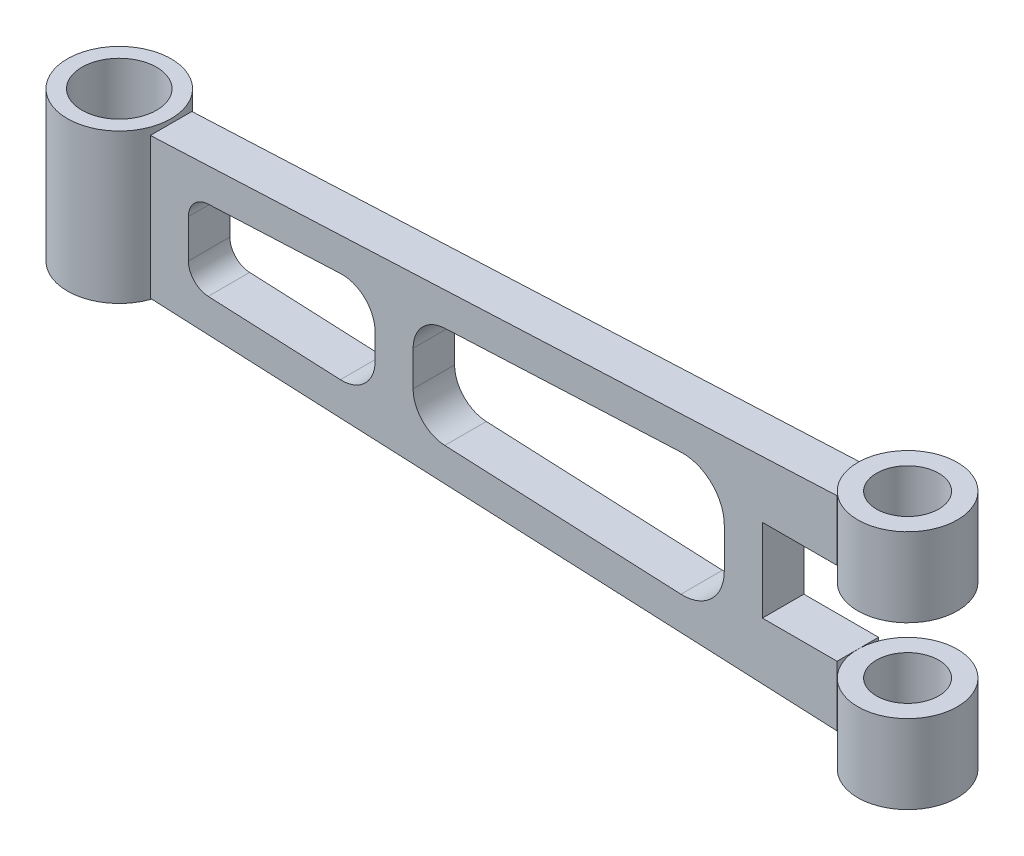
ISO-10303-21;
HEADER;
FILE_DESCRIPTION(('STEP AP214'),'2;1');
FILE_NAME('part.step','',(''),(''),'','','');
FILE_SCHEMA(('AUTOMOTIVE_DESIGN { 1 0 10303 214 1 1 1 1 }'));
ENDSEC;
DATA;
#1=APPLICATION_CONTEXT('core data for automotive mechanical design processes');
#2=APPLICATION_PROTOCOL_DEFINITION('international standard','automotive_design',2000,#1);
#3=PRODUCT_CONTEXT('',#1,'mechanical');
#4=PRODUCT('Part','Part','',(#3));
#5=PRODUCT_RELATED_PRODUCT_CATEGORY('part','',(#4));
#6=PRODUCT_DEFINITION_FORMATION('','',#4);
#7=PRODUCT_DEFINITION_CONTEXT('part definition',#1,'design');
#8=PRODUCT_DEFINITION('design','',#6,#7);
#9=PRODUCT_DEFINITION_SHAPE('','',#8);
#10=(LENGTH_UNIT() NAMED_UNIT(*) SI_UNIT(.MILLI.,.METRE.));
#11=(NAMED_UNIT(*) PLANE_ANGLE_UNIT() SI_UNIT($,.RADIAN.));
#12=(NAMED_UNIT(*) SI_UNIT($,.STERADIAN.) SOLID_ANGLE_UNIT());
#13=UNCERTAINTY_MEASURE_WITH_UNIT(LENGTH_MEASURE(1.E-05),#10,'distance_accuracy_value','');
#14=(GEOMETRIC_REPRESENTATION_CONTEXT(3) GLOBAL_UNCERTAINTY_ASSIGNED_CONTEXT((#13)) GLOBAL_UNIT_ASSIGNED_CONTEXT((#10,
#11,#12)) REPRESENTATION_CONTEXT('',''));
#15=CARTESIAN_POINT('',(0.,0.,0.));
#16=DIRECTION('',(0.,0.,1.));
#17=DIRECTION('',(1.,0.,0.));
#18=AXIS2_PLACEMENT_3D('',#15,#16,#17);
#19=CARTESIAN_POINT('',(177.5,29.,-5.));
#20=DIRECTION('',(0.,-1.,0.));
#21=DIRECTION('',(0.,0.,1.));
#22=AXIS2_PLACEMENT_3D('',#19,#20,#21);
#23=CYLINDRICAL_SURFACE('',#22,12.);
#24=CARTESIAN_POINT('',(177.5,29.,-5.));
#25=DIRECTION('',(0.,1.,0.));
#26=DIRECTION('',(0.,0.,1.));
#27=AXIS2_PLACEMENT_3D('',#24,#25,#26);
#28=CIRCLE('',#27,12.);
#29=CARTESIAN_POINT('',(177.5,29.,7.));
#30=VERTEX_POINT('',#29);
#31=EDGE_CURVE('E11',#30,#30,#28,.T.);
#32=ORIENTED_EDGE('',*,*,#31,.F.);
#33=EDGE_LOOP('',(#32));
#34=FACE_BOUND('',#33,.T.);
#35=CARTESIAN_POINT('',(177.5,10.,-5.));
#36=DIRECTION('',(0.,1.,0.));
#37=DIRECTION('',(0.,0.,1.));
#38=AXIS2_PLACEMENT_3D('',#35,#36,#37);
#39=CIRCLE('',#38,12.);
#40=CARTESIAN_POINT('',(177.5,10.,7.));
#41=VERTEX_POINT('',#40);
#42=EDGE_CURVE('E56',#41,#41,#39,.T.);
#43=ORIENTED_EDGE('',*,*,#42,.T.);
#44=EDGE_LOOP('',(#43));
#45=FACE_BOUND('',#44,.T.);
#46=ADVANCED_FACE('F53',(#34,#45),#23,.T.);
#47=CARTESIAN_POINT('',(177.5,29.,-5.));
#48=DIRECTION('',(0.,-1.,0.));
#49=DIRECTION('',(0.,0.,1.));
#50=AXIS2_PLACEMENT_3D('',#47,#48,#49);
#51=PLANE('',#50);
#52=CARTESIAN_POINT('',(177.5,29.,-5.));
#53=DIRECTION('',(0.,1.,0.));
#54=DIRECTION('',(0.,0.,1.));
#55=AXIS2_PLACEMENT_3D('',#52,#53,#54);
#56=CIRCLE('',#55,7.50000000000001);
#57=CARTESIAN_POINT('',(177.5,29.,2.50000000000001));
#58=VERTEX_POINT('',#57);
#59=EDGE_CURVE('E63',#58,#58,#56,.T.);
#60=ORIENTED_EDGE('',*,*,#59,.F.);
#61=EDGE_LOOP('',(#60));
#62=FACE_BOUND('',#61,.T.);
#63=ORIENTED_EDGE('',*,*,#31,.T.);
#64=EDGE_LOOP('',(#63));
#65=FACE_BOUND('',#64,.T.);
#66=ADVANCED_FACE('F74',(#62,#65),#51,.F.);
#67=CARTESIAN_POINT('',(177.5,10.,-5.));
#68=DIRECTION('',(0.,-1.,0.));
#69=DIRECTION('',(0.,0.,1.));
#70=AXIS2_PLACEMENT_3D('',#67,#68,#69);
#71=PLANE('',#70);
#72=CARTESIAN_POINT('',(177.5,10.,-5.));
#73=DIRECTION('',(0.,1.,0.));
#74=DIRECTION('',(0.,0.,1.));
#75=AXIS2_PLACEMENT_3D('',#72,#73,#74);
#76=CIRCLE('',#75,7.50000000000001);
#77=CARTESIAN_POINT('',(177.5,10.,2.50000000000001));
#78=VERTEX_POINT('',#77);
#79=EDGE_CURVE('E65',#78,#78,#76,.T.);
#80=ORIENTED_EDGE('',*,*,#79,.T.);
#81=EDGE_LOOP('',(#80));
#82=FACE_BOUND('',#81,.T.);
#83=ORIENTED_EDGE('',*,*,#42,.F.);
#84=EDGE_LOOP('',(#83));
#85=FACE_BOUND('',#84,.T.);
#86=ADVANCED_FACE('F76',(#82,#85),#71,.T.);
#87=CARTESIAN_POINT('',(177.5,29.,-5.));
#88=DIRECTION('',(0.,-1.,0.));
#89=DIRECTION('',(0.,0.,1.));
#90=AXIS2_PLACEMENT_3D('',#87,#88,#89);
#91=CYLINDRICAL_SURFACE('',#90,7.50000000000001);
#92=ORIENTED_EDGE('',*,*,#59,.T.);
#93=EDGE_LOOP('',(#92));
#94=FACE_BOUND('',#93,.T.);
#95=ORIENTED_EDGE('',*,*,#79,.F.);
#96=EDGE_LOOP('',(#95));
#97=FACE_BOUND('',#96,.T.);
#98=ADVANCED_FACE('F71',(#94,#97),#91,.F.);
#99=CLOSED_SHELL('',(#46,#66,#86,#98));
#100=MANIFOLD_SOLID_BREP('B2',#99);
#101=CARTESIAN_POINT('',(177.5,-29.,-5.));
#102=DIRECTION('',(0.,1.,0.));
#103=DIRECTION('',(0.,0.,1.));
#104=AXIS2_PLACEMENT_3D('',#101,#102,#103);
#105=CYLINDRICAL_SURFACE('',#104,12.);
#106=CARTESIAN_POINT('',(177.5,-29.,-5.));
#107=DIRECTION('',(0.,1.,0.));
#108=DIRECTION('',(0.,0.,1.));
#109=AXIS2_PLACEMENT_3D('',#106,#107,#108);
#110=CIRCLE('',#109,12.);
#111=CARTESIAN_POINT('',(177.5,-29.,7.));
#112=VERTEX_POINT('',#111);
#113=EDGE_CURVE('E52',#112,#112,#110,.T.);
#114=ORIENTED_EDGE('',*,*,#113,.T.);
#115=EDGE_LOOP('',(#114));
#116=FACE_BOUND('',#115,.T.);
#117=CARTESIAN_POINT('',(177.5,-10.,-5.));
#118=DIRECTION('',(0.,1.,0.));
#119=DIRECTION('',(0.,0.,1.));
#120=AXIS2_PLACEMENT_3D('',#117,#118,#119);
#121=CIRCLE('',#120,12.);
#122=CARTESIAN_POINT('',(177.5,-10.,7.));
#123=VERTEX_POINT('',#122);
#124=EDGE_CURVE('E125',#123,#123,#121,.T.);
#125=ORIENTED_EDGE('',*,*,#124,.F.);
#126=EDGE_LOOP('',(#125));
#127=FACE_BOUND('',#126,.T.);
#128=ADVANCED_FACE('F122',(#116,#127),#105,.T.);
#129=CARTESIAN_POINT('',(177.5,-29.,-5.));
#130=DIRECTION('',(0.,1.,0.));
#131=DIRECTION('',(0.,0.,1.));
#132=AXIS2_PLACEMENT_3D('',#129,#130,#131);
#133=PLANE('',#132);
#134=CARTESIAN_POINT('',(177.5,-29.,-5.));
#135=DIRECTION('',(0.,1.,0.));
#136=DIRECTION('',(0.,0.,1.));
#137=AXIS2_PLACEMENT_3D('',#134,#135,#136);
#138=CIRCLE('',#137,7.50000000000001);
#139=CARTESIAN_POINT('',(177.5,-29.,2.50000000000001));
#140=VERTEX_POINT('',#139);
#141=EDGE_CURVE('E132',#140,#140,#138,.T.);
#142=ORIENTED_EDGE('',*,*,#141,.T.);
#143=EDGE_LOOP('',(#142));
#144=FACE_BOUND('',#143,.T.);
#145=ORIENTED_EDGE('',*,*,#113,.F.);
#146=EDGE_LOOP('',(#145));
#147=FACE_BOUND('',#146,.T.);
#148=ADVANCED_FACE('F140',(#144,#147),#133,.F.);
#149=CARTESIAN_POINT('',(177.5,-10.,-5.));
#150=DIRECTION('',(0.,1.,0.));
#151=DIRECTION('',(0.,0.,1.));
#152=AXIS2_PLACEMENT_3D('',#149,#150,#151);
#153=PLANE('',#152);
#154=CARTESIAN_POINT('',(177.5,-10.,-5.));
#155=DIRECTION('',(0.,1.,0.));
#156=DIRECTION('',(0.,0.,1.));
#157=AXIS2_PLACEMENT_3D('',#154,#155,#156);
#158=CIRCLE('',#157,7.50000000000001);
#159=CARTESIAN_POINT('',(177.5,-10.,2.50000000000001));
#160=VERTEX_POINT('',#159);
#161=EDGE_CURVE('E134',#160,#160,#158,.T.);
#162=ORIENTED_EDGE('',*,*,#161,.F.);
#163=EDGE_LOOP('',(#162));
#164=FACE_BOUND('',#163,.T.);
#165=ORIENTED_EDGE('',*,*,#124,.T.);
#166=EDGE_LOOP('',(#165));
#167=FACE_BOUND('',#166,.T.);
#168=ADVANCED_FACE('F146',(#164,#167),#153,.T.);
#169=CARTESIAN_POINT('',(177.5,-29.,-5.));
#170=DIRECTION('',(0.,1.,0.));
#171=DIRECTION('',(0.,0.,1.));
#172=AXIS2_PLACEMENT_3D('',#169,#170,#171);
#173=CYLINDRICAL_SURFACE('',#172,7.50000000000001);
#174=ORIENTED_EDGE('',*,*,#141,.F.);
#175=EDGE_LOOP('',(#174));
#176=FACE_BOUND('',#175,.T.);
#177=ORIENTED_EDGE('',*,*,#161,.T.);
#178=EDGE_LOOP('',(#177));
#179=FACE_BOUND('',#178,.T.);
#180=ADVANCED_FACE('F143',(#176,#179),#173,.F.);
#181=CLOSED_SHELL('',(#128,#148,#168,#180));
#182=MANIFOLD_SOLID_BREP('B6',#181);
#183=CARTESIAN_POINT('',(-12.5,18.,-5.));
#184=DIRECTION('',(0.,1.,0.));
#185=DIRECTION('',(0.,0.,1.));
#186=AXIS2_PLACEMENT_3D('',#183,#184,#185);
#187=PLANE('',#186);
#188=CARTESIAN_POINT('',(-12.5,18.,-5.));
#189=DIRECTION('',(0.,1.,0.));
#190=DIRECTION('',(0.,0.,1.));
#191=AXIS2_PLACEMENT_3D('',#188,#189,#190);
#192=CIRCLE('',#191,12.5);
#193=CARTESIAN_POINT('',(-12.5,18.,7.5));
#194=VERTEX_POINT('',#193);
#195=EDGE_CURVE('E121',#194,#194,#192,.T.);
#196=ORIENTED_EDGE('',*,*,#195,.T.);
#197=EDGE_LOOP('',(#196));
#198=FACE_BOUND('',#197,.T.);
#199=CARTESIAN_POINT('',(-12.5,18.,-5.));
#200=DIRECTION('',(0.,1.,0.));
#201=DIRECTION('',(0.,0.,1.));
#202=AXIS2_PLACEMENT_3D('',#199,#200,#201);
#203=CIRCLE('',#202,9.);
#204=CARTESIAN_POINT('',(-12.5,18.,4.));
#205=VERTEX_POINT('',#204);
#206=EDGE_CURVE('E203',#205,#205,#203,.T.);
#207=ORIENTED_EDGE('',*,*,#206,.F.);
#208=EDGE_LOOP('',(#207));
#209=FACE_BOUND('',#208,.T.);
#210=ADVANCED_FACE('F192',(#198,#209),#187,.T.);
#211=CARTESIAN_POINT('',(-12.5,-18.,-5.));
#212=DIRECTION('',(0.,1.,0.));
#213=DIRECTION('',(0.,0.,1.));
#214=AXIS2_PLACEMENT_3D('',#211,#212,#213);
#215=PLANE('',#214);
#216=CARTESIAN_POINT('',(-12.5,-18.,-5.));
#217=DIRECTION('',(0.,1.,0.));
#218=DIRECTION('',(0.,0.,1.));
#219=AXIS2_PLACEMENT_3D('',#216,#217,#218);
#220=CIRCLE('',#219,12.5);
#221=CARTESIAN_POINT('',(-12.5,-18.,7.5));
#222=VERTEX_POINT('',#221);
#223=EDGE_CURVE('E196',#222,#222,#220,.T.);
#224=ORIENTED_EDGE('',*,*,#223,.F.);
#225=EDGE_LOOP('',(#224));
#226=FACE_BOUND('',#225,.T.);
#227=CARTESIAN_POINT('',(-12.5,-18.,-5.));
#228=DIRECTION('',(0.,1.,0.));
#229=DIRECTION('',(0.,0.,1.));
#230=AXIS2_PLACEMENT_3D('',#227,#228,#229);
#231=CIRCLE('',#230,9.);
#232=CARTESIAN_POINT('',(-12.5,-18.,4.));
#233=VERTEX_POINT('',#232);
#234=EDGE_CURVE('E205',#233,#233,#231,.T.);
#235=ORIENTED_EDGE('',*,*,#234,.T.);
#236=EDGE_LOOP('',(#235));
#237=FACE_BOUND('',#236,.T.);
#238=ADVANCED_FACE('F215',(#226,#237),#215,.F.);
#239=CARTESIAN_POINT('',(-12.5,18.,-5.));
#240=DIRECTION('',(0.,-1.,0.));
#241=DIRECTION('',(0.,0.,-1.));
#242=AXIS2_PLACEMENT_3D('',#239,#240,#241);
#243=CYLINDRICAL_SURFACE('',#242,12.5);
#244=ORIENTED_EDGE('',*,*,#195,.F.);
#245=EDGE_LOOP('',(#244));
#246=FACE_BOUND('',#245,.T.);
#247=ORIENTED_EDGE('',*,*,#223,.T.);
#248=EDGE_LOOP('',(#247));
#249=FACE_BOUND('',#248,.T.);
#250=ADVANCED_FACE('F194',(#246,#249),#243,.T.);
#251=CARTESIAN_POINT('',(-12.5,18.,-5.));
#252=DIRECTION('',(0.,-1.,0.));
#253=DIRECTION('',(0.,0.,-1.));
#254=AXIS2_PLACEMENT_3D('',#251,#252,#253);
#255=CYLINDRICAL_SURFACE('',#254,9.);
#256=ORIENTED_EDGE('',*,*,#206,.T.);
#257=EDGE_LOOP('',(#256));
#258=FACE_BOUND('',#257,.T.);
#259=ORIENTED_EDGE('',*,*,#234,.F.);
#260=EDGE_LOOP('',(#259));
#261=FACE_BOUND('',#260,.T.);
#262=ADVANCED_FACE('F211',(#258,#261),#255,.F.);
#263=CLOSED_SHELL('',(#210,#238,#250,#262));
#264=MANIFOLD_SOLID_BREP('B47',#263);
#265=CARTESIAN_POINT('',(9.16,0.,-10.));
#266=DIRECTION('',(1.,0.,0.));
#267=DIRECTION('',(0.,1.,0.));
#268=AXIS2_PLACEMENT_3D('',#265,#266,#267);
#269=PLANE('',#268);
#270=DIRECTION('',(0.,1.,0.));
#271=VECTOR('',#270,1.);
#272=CARTESIAN_POINT('',(9.16,0.,0.));
#273=LINE('',#272,#271);
#274=CARTESIAN_POINT('',(9.16,-4.6326805453147,0.));
#275=VERTEX_POINT('',#274);
#276=CARTESIAN_POINT('',(9.16,4.63268054531471,0.));
#277=VERTEX_POINT('',#276);
#278=EDGE_CURVE('E514',#275,#277,#273,.T.);
#279=ORIENTED_EDGE('',*,*,#278,.F.);
#280=DIRECTION('',(0.,0.,1.));
#281=VECTOR('',#280,1.);
#282=CARTESIAN_POINT('',(9.16,-4.6326805453147,-10.));
#283=LINE('',#282,#281);
#284=CARTESIAN_POINT('',(9.16,-4.6326805453147,-10.));
#285=VERTEX_POINT('',#284);
#286=EDGE_CURVE('E190',#285,#275,#283,.T.);
#287=ORIENTED_EDGE('',*,*,#286,.F.);
#288=DIRECTION('',(0.,1.,0.));
#289=VECTOR('',#288,1.);
#290=CARTESIAN_POINT('',(9.16,0.,-10.));
#291=LINE('',#290,#289);
#292=CARTESIAN_POINT('',(9.16,4.63268054531471,-10.));
#293=VERTEX_POINT('',#292);
#294=EDGE_CURVE('E678',#285,#293,#291,.T.);
#295=ORIENTED_EDGE('',*,*,#294,.T.);
#296=DIRECTION('',(0.,0.,1.));
#297=VECTOR('',#296,1.);
#298=CARTESIAN_POINT('',(9.16,4.63268054531471,-10.));
#299=LINE('',#298,#297);
#300=EDGE_CURVE('E557',#293,#277,#299,.T.);
#301=ORIENTED_EDGE('',*,*,#300,.T.);
#302=EDGE_LOOP('',(#279,#287,#295,#301));
#303=FACE_BOUND('',#302,.T.);
#304=ADVANCED_FACE('F253',(#303),#269,.T.);
#305=CARTESIAN_POINT('',(14.16,-4.6326805453147,-10.));
#306=DIRECTION('',(0.,0.,1.));
#307=DIRECTION('',(1.,0.,0.));
#308=AXIS2_PLACEMENT_3D('',#305,#306,#307);
#309=CYLINDRICAL_SURFACE('',#308,5.);
#310=CARTESIAN_POINT('',(14.16,-4.6326805453147,0.));
#311=DIRECTION('',(0.,0.,1.));
#312=DIRECTION('',(1.,0.,0.));
#313=AXIS2_PLACEMENT_3D('',#310,#311,#312);
#314=CIRCLE('',#313,5.);
#315=CARTESIAN_POINT('',(13.9320554258957,-9.62748196990973,0.));
#316=VERTEX_POINT('',#315);
#317=EDGE_CURVE('E539',#316,#275,#314,.F.);
#318=ORIENTED_EDGE('',*,*,#317,.F.);
#319=DIRECTION('',(0.,0.,1.));
#320=VECTOR('',#319,1.);
#321=CARTESIAN_POINT('',(13.9320554258957,-9.62748196990973,-10.));
#322=LINE('',#321,#320);
#323=CARTESIAN_POINT('',(13.9320554258957,-9.62748196990973,-10.));
#324=VERTEX_POINT('',#323);
#325=EDGE_CURVE('E264',#324,#316,#322,.T.);
#326=ORIENTED_EDGE('',*,*,#325,.F.);
#327=CARTESIAN_POINT('',(14.16,-4.6326805453147,-10.));
#328=DIRECTION('',(0.,0.,1.));
#329=DIRECTION('',(1.,0.,0.));
#330=AXIS2_PLACEMENT_3D('',#327,#328,#329);
#331=CIRCLE('',#330,5.);
#332=EDGE_CURVE('E441',#324,#285,#331,.F.);
#333=ORIENTED_EDGE('',*,*,#332,.T.);
#334=ORIENTED_EDGE('',*,*,#286,.T.);
#335=EDGE_LOOP('',(#318,#326,#333,#334));
#336=FACE_BOUND('',#335,.T.);
#337=ADVANCED_FACE('F703',(#336),#309,.F.);
#338=CARTESIAN_POINT('',(-0.409494442189137,-8.97298578502075,-10.));
#339=DIRECTION('',(0.0455889148208501,0.998960284919004,0.));
#340=DIRECTION('',(-0.998960284919004,0.0455889148208501,0.));
#341=AXIS2_PLACEMENT_3D('',#338,#339,#340);
#342=PLANE('',#341);
#343=DIRECTION('',(-0.998960284919004,0.0455889148208501,0.));
#344=VECTOR('',#343,1.);
#345=CARTESIAN_POINT('',(-0.409494442189137,-8.97298578502075,0.));
#346=LINE('',#345,#344);
#347=CARTESIAN_POINT('',(45.7952886814332,-11.0816040693897,0.));
#348=VERTEX_POINT('',#347);
#349=EDGE_CURVE('E427',#348,#316,#346,.T.);
#350=ORIENTED_EDGE('',*,*,#349,.F.);
#351=DIRECTION('',(0.,0.,1.));
#352=VECTOR('',#351,1.);
#353=CARTESIAN_POINT('',(45.7952886814332,-11.0816040693897,-10.));
#354=LINE('',#353,#352);
#355=CARTESIAN_POINT('',(45.7952886814332,-11.0816040693897,-10.));
#356=VERTEX_POINT('',#355);
#357=EDGE_CURVE('E422',#356,#348,#354,.T.);
#358=ORIENTED_EDGE('',*,*,#357,.F.);
#359=DIRECTION('',(-0.998960284919004,0.0455889148208501,0.));
#360=VECTOR('',#359,1.);
#361=CARTESIAN_POINT('',(-0.409494442189137,-8.97298578502075,-10.));
#362=LINE('',#361,#360);
#363=EDGE_CURVE('E425',#356,#324,#362,.T.);
#364=ORIENTED_EDGE('',*,*,#363,.T.);
#365=ORIENTED_EDGE('',*,*,#325,.T.);
#366=EDGE_LOOP('',(#350,#358,#364,#365));
#367=FACE_BOUND('',#366,.T.);
#368=ADVANCED_FACE('F424',(#367),#342,.T.);
#369=CARTESIAN_POINT('',(46.16,-3.08992179003771,-10.));
#370=DIRECTION('',(0.,0.,1.));
#371=DIRECTION('',(1.,0.,0.));
#372=AXIS2_PLACEMENT_3D('',#369,#370,#371);
#373=CYLINDRICAL_SURFACE('',#372,8.);
#374=CARTESIAN_POINT('',(46.16,-3.08992179003771,0.));
#375=DIRECTION('',(0.,0.,1.));
#376=DIRECTION('',(1.,0.,0.));
#377=AXIS2_PLACEMENT_3D('',#374,#375,#376);
#378=CIRCLE('',#377,8.);
#379=CARTESIAN_POINT('',(54.16,-3.08992179003771,0.));
#380=VERTEX_POINT('',#379);
#381=EDGE_CURVE('E534',#380,#348,#378,.F.);
#382=ORIENTED_EDGE('',*,*,#381,.F.);
#383=DIRECTION('',(0.,0.,1.));
#384=VECTOR('',#383,1.);
#385=CARTESIAN_POINT('',(54.16,-3.08992179003771,-10.));
#386=LINE('',#385,#384);
#387=CARTESIAN_POINT('',(54.16,-3.08992179003771,-10.));
#388=VERTEX_POINT('',#387);
#389=EDGE_CURVE('E433',#388,#380,#386,.T.);
#390=ORIENTED_EDGE('',*,*,#389,.F.);
#391=CARTESIAN_POINT('',(46.16,-3.08992179003771,-10.));
#392=DIRECTION('',(0.,0.,1.));
#393=DIRECTION('',(1.,0.,0.));
#394=AXIS2_PLACEMENT_3D('',#391,#392,#393);
#395=CIRCLE('',#394,8.);
#396=EDGE_CURVE('E439',#388,#356,#395,.F.);
#397=ORIENTED_EDGE('',*,*,#396,.T.);
#398=ORIENTED_EDGE('',*,*,#357,.T.);
#399=EDGE_LOOP('',(#382,#390,#397,#398));
#400=FACE_BOUND('',#399,.T.);
#401=ADVANCED_FACE('F444',(#400),#373,.F.);
#402=CARTESIAN_POINT('',(54.16,0.,-10.));
#403=DIRECTION('',(-1.,0.,0.));
#404=DIRECTION('',(0.,0.,1.));
#405=AXIS2_PLACEMENT_3D('',#402,#403,#404);
#406=PLANE('',#405);
#407=DIRECTION('',(0.,-1.,0.));
#408=VECTOR('',#407,1.);
#409=CARTESIAN_POINT('',(54.16,0.,0.));
#410=LINE('',#409,#408);
#411=CARTESIAN_POINT('',(54.16,3.08992179003771,0.));
#412=VERTEX_POINT('',#411);
#413=EDGE_CURVE('E530',#412,#380,#410,.T.);
#414=ORIENTED_EDGE('',*,*,#413,.F.);
#415=DIRECTION('',(0.,0.,1.));
#416=VECTOR('',#415,1.);
#417=CARTESIAN_POINT('',(54.16,3.08992179003771,-10.));
#418=LINE('',#417,#416);
#419=CARTESIAN_POINT('',(54.16,3.08992179003771,-10.));
#420=VERTEX_POINT('',#419);
#421=EDGE_CURVE('E548',#420,#412,#418,.T.);
#422=ORIENTED_EDGE('',*,*,#421,.F.);
#423=DIRECTION('',(0.,-1.,0.));
#424=VECTOR('',#423,1.);
#425=CARTESIAN_POINT('',(54.16,0.,-10.));
#426=LINE('',#425,#424);
#427=EDGE_CURVE('E446',#420,#388,#426,.T.);
#428=ORIENTED_EDGE('',*,*,#427,.T.);
#429=ORIENTED_EDGE('',*,*,#389,.T.);
#430=EDGE_LOOP('',(#414,#422,#428,#429));
#431=FACE_BOUND('',#430,.T.);
#432=ADVANCED_FACE('F717',(#431),#406,.T.);
#433=CARTESIAN_POINT('',(46.16,3.08992179003771,-10.));
#434=DIRECTION('',(0.,0.,1.));
#435=DIRECTION('',(1.,0.,0.));
#436=AXIS2_PLACEMENT_3D('',#433,#434,#435);
#437=CYLINDRICAL_SURFACE('',#436,8.);
#438=CARTESIAN_POINT('',(46.16,3.08992179003771,0.));
#439=DIRECTION('',(0.,0.,1.));
#440=DIRECTION('',(1.,0.,0.));
#441=AXIS2_PLACEMENT_3D('',#438,#439,#440);
#442=CIRCLE('',#441,8.);
#443=CARTESIAN_POINT('',(45.7952886814332,11.0816040693897,0.));
#444=VERTEX_POINT('',#443);
#445=EDGE_CURVE('E526',#412,#444,#442,.T.);
#446=ORIENTED_EDGE('',*,*,#445,.T.);
#447=DIRECTION('',(0.,0.,1.));
#448=VECTOR('',#447,1.);
#449=CARTESIAN_POINT('',(45.7952886814332,11.0816040693897,-10.));
#450=LINE('',#449,#448);
#451=CARTESIAN_POINT('',(45.7952886814332,11.0816040693897,-10.));
#452=VERTEX_POINT('',#451);
#453=EDGE_CURVE('E551',#452,#444,#450,.T.);
#454=ORIENTED_EDGE('',*,*,#453,.F.);
#455=CARTESIAN_POINT('',(46.16,3.08992179003771,-10.));
#456=DIRECTION('',(0.,0.,1.));
#457=DIRECTION('',(1.,0.,0.));
#458=AXIS2_PLACEMENT_3D('',#455,#456,#457);
#459=CIRCLE('',#458,8.);
#460=EDGE_CURVE('E449',#420,#452,#459,.T.);
#461=ORIENTED_EDGE('',*,*,#460,.F.);
#462=ORIENTED_EDGE('',*,*,#421,.T.);
#463=EDGE_LOOP('',(#446,#454,#461,#462));
#464=FACE_BOUND('',#463,.T.);
#465=ADVANCED_FACE('F694',(#464),#437,.F.);
#466=CARTESIAN_POINT('',(-0.409494442189137,8.97298578502075,-10.));
#467=DIRECTION('',(0.04558891482085,-0.998960284919004,0.));
#468=DIRECTION('',(0.998960284919004,0.04558891482085,0.));
#469=AXIS2_PLACEMENT_3D('',#466,#467,#468);
#470=PLANE('',#469);
#471=DIRECTION('',(0.998960284919004,0.04558891482085,0.));
#472=VECTOR('',#471,1.);
#473=CARTESIAN_POINT('',(-0.409494442189137,8.97298578502075,0.));
#474=LINE('',#473,#472);
#475=CARTESIAN_POINT('',(13.9320554258957,9.62748196990973,0.));
#476=VERTEX_POINT('',#475);
#477=EDGE_CURVE('E522',#476,#444,#474,.T.);
#478=ORIENTED_EDGE('',*,*,#477,.F.);
#479=DIRECTION('',(0.,0.,1.));
#480=VECTOR('',#479,1.);
#481=CARTESIAN_POINT('',(13.9320554258957,9.62748196990973,-10.));
#482=LINE('',#481,#480);
#483=CARTESIAN_POINT('',(13.9320554258957,9.62748196990973,-10.));
#484=VERTEX_POINT('',#483);
#485=EDGE_CURVE('E554',#484,#476,#482,.T.);
#486=ORIENTED_EDGE('',*,*,#485,.F.);
#487=DIRECTION('',(0.998960284919004,0.04558891482085,0.));
#488=VECTOR('',#487,1.);
#489=CARTESIAN_POINT('',(-0.409494442189137,8.97298578502075,-10.));
#490=LINE('',#489,#488);
#491=EDGE_CURVE('E685',#484,#452,#490,.T.);
#492=ORIENTED_EDGE('',*,*,#491,.T.);
#493=ORIENTED_EDGE('',*,*,#453,.T.);
#494=EDGE_LOOP('',(#478,#486,#492,#493));
#495=FACE_BOUND('',#494,.T.);
#496=ADVANCED_FACE('F698',(#495),#470,.T.);
#497=CARTESIAN_POINT('',(-0.774205760755939,-16.9646680643728,-10.));
#498=DIRECTION('',(0.0455889148208501,0.998960284919004,0.));
#499=DIRECTION('',(-0.998960284919004,0.0455889148208501,0.));
#500=AXIS2_PLACEMENT_3D('',#497,#498,#499);
#501=PLANE('',#500);
#502=DIRECTION('',(-0.998960284919004,0.0455889148208501,0.));
#503=VECTOR('',#502,1.);
#504=CARTESIAN_POINT('',(-0.774205760755939,-16.9646680643728,0.));
#505=LINE('',#504,#503);
#506=CARTESIAN_POINT('',(165.5,-24.5528181818184,0.));
#507=VERTEX_POINT('',#506);
#508=CARTESIAN_POINT('',(0.,-17.,0.));
#509=VERTEX_POINT('',#508);
#510=EDGE_CURVE('E486',#507,#509,#505,.T.);
#511=ORIENTED_EDGE('',*,*,#510,.T.);
#512=DIRECTION('',(0.,0.,1.));
#513=VECTOR('',#512,1.);
#514=CARTESIAN_POINT('',(0.,-17.,-10.));
#515=LINE('',#514,#513);
#516=CARTESIAN_POINT('',(0.,-17.,-10.));
#517=VERTEX_POINT('',#516);
#518=EDGE_CURVE('E560',#517,#509,#515,.T.);
#519=ORIENTED_EDGE('',*,*,#518,.F.);
#520=DIRECTION('',(-0.998960284919004,0.0455889148208501,0.));
#521=VECTOR('',#520,1.);
#522=CARTESIAN_POINT('',(-0.774205760755939,-16.9646680643728,-10.));
#523=LINE('',#522,#521);
#524=CARTESIAN_POINT('',(165.5,-24.5528181818184,-10.));
#525=VERTEX_POINT('',#524);
#526=EDGE_CURVE('E629',#525,#517,#523,.T.);
#527=ORIENTED_EDGE('',*,*,#526,.F.);
#528=DIRECTION('',(0.,0.,1.));
#529=VECTOR('',#528,1.);
#530=CARTESIAN_POINT('',(165.5,-24.5528181818184,-10.));
#531=LINE('',#530,#529);
#532=EDGE_CURVE('E585',#525,#507,#531,.T.);
#533=ORIENTED_EDGE('',*,*,#532,.T.);
#534=EDGE_LOOP('',(#511,#519,#527,#533));
#535=FACE_BOUND('',#534,.T.);
#536=ADVANCED_FACE('F725',(#535),#501,.F.);
#537=CARTESIAN_POINT('',(0.,0.,-10.));
#538=DIRECTION('',(-1.,0.,0.));
#539=DIRECTION('',(0.,-1.,0.));
#540=AXIS2_PLACEMENT_3D('',#537,#538,#539);
#541=PLANE('',#540);
#542=DIRECTION('',(0.,-1.,0.));
#543=VECTOR('',#542,1.);
#544=CARTESIAN_POINT('',(0.,0.,0.));
#545=LINE('',#544,#543);
#546=CARTESIAN_POINT('',(0.,17.,0.));
#547=VERTEX_POINT('',#546);
#548=EDGE_CURVE('E510',#547,#509,#545,.T.);
#549=ORIENTED_EDGE('',*,*,#548,.F.);
#550=DIRECTION('',(0.,0.,1.));
#551=VECTOR('',#550,1.);
#552=CARTESIAN_POINT('',(0.,17.,-10.));
#553=LINE('',#552,#551);
#554=CARTESIAN_POINT('',(0.,17.,-10.));
#555=VERTEX_POINT('',#554);
#556=EDGE_CURVE('E563',#555,#547,#553,.T.);
#557=ORIENTED_EDGE('',*,*,#556,.F.);
#558=DIRECTION('',(0.,-1.,0.));
#559=VECTOR('',#558,1.);
#560=CARTESIAN_POINT('',(0.,0.,-10.));
#561=LINE('',#560,#559);
#562=EDGE_CURVE('E674',#555,#517,#561,.T.);
#563=ORIENTED_EDGE('',*,*,#562,.T.);
#564=ORIENTED_EDGE('',*,*,#518,.T.);
#565=EDGE_LOOP('',(#549,#557,#563,#564));
#566=FACE_BOUND('',#565,.T.);
#567=ADVANCED_FACE('F729',(#566),#541,.T.);
#568=CARTESIAN_POINT('',(-0.774205760755939,16.9646680643728,-10.));
#569=DIRECTION('',(0.0455889148208501,-0.998960284919004,0.));
#570=DIRECTION('',(0.998960284919004,0.0455889148208501,0.));
#571=AXIS2_PLACEMENT_3D('',#568,#569,#570);
#572=PLANE('',#571);
#573=DIRECTION('',(0.998960284919004,0.0455889148208501,0.));
#574=VECTOR('',#573,1.);
#575=CARTESIAN_POINT('',(-0.774205760755939,16.9646680643728,0.));
#576=LINE('',#575,#574);
#577=CARTESIAN_POINT('',(165.5,24.5528181818184,0.));
#578=VERTEX_POINT('',#577);
#579=EDGE_CURVE('E507',#547,#578,#576,.T.);
#580=ORIENTED_EDGE('',*,*,#579,.T.);
#581=DIRECTION('',(0.,0.,1.));
#582=VECTOR('',#581,1.);
#583=CARTESIAN_POINT('',(165.5,24.5528181818184,-10.));
#584=LINE('',#583,#582);
#585=CARTESIAN_POINT('',(165.5,24.5528181818184,-10.));
#586=VERTEX_POINT('',#585);
#587=EDGE_CURVE('E566',#586,#578,#584,.T.);
#588=ORIENTED_EDGE('',*,*,#587,.F.);
#589=DIRECTION('',(0.998960284919004,0.0455889148208501,0.));
#590=VECTOR('',#589,1.);
#591=CARTESIAN_POINT('',(-0.774205760755939,16.9646680643728,-10.));
#592=LINE('',#591,#590);
#593=EDGE_CURVE('E671',#555,#586,#592,.T.);
#594=ORIENTED_EDGE('',*,*,#593,.F.);
#595=ORIENTED_EDGE('',*,*,#556,.T.);
#596=EDGE_LOOP('',(#580,#588,#594,#595));
#597=FACE_BOUND('',#596,.T.);
#598=ADVANCED_FACE('F732',(#597),#572,.F.);
#599=CARTESIAN_POINT('',(165.5,0.,-10.));
#600=DIRECTION('',(-1.,0.,0.));
#601=DIRECTION('',(0.,0.,1.));
#602=AXIS2_PLACEMENT_3D('',#599,#600,#601);
#603=PLANE('',#602);
#604=DIRECTION('',(0.,-1.,0.));
#605=VECTOR('',#604,1.);
#606=CARTESIAN_POINT('',(165.5,0.,0.));
#607=LINE('',#606,#605);
#608=CARTESIAN_POINT('',(165.5,10.,0.));
#609=VERTEX_POINT('',#608);
#610=EDGE_CURVE('E504',#578,#609,#607,.T.);
#611=ORIENTED_EDGE('',*,*,#610,.T.);
#612=DIRECTION('',(0.,0.,1.));
#613=VECTOR('',#612,1.);
#614=CARTESIAN_POINT('',(165.5,10.,-10.));
#615=LINE('',#614,#613);
#616=CARTESIAN_POINT('',(165.5,10.,-10.));
#617=VERTEX_POINT('',#616);
#618=EDGE_CURVE('E570',#617,#609,#615,.T.);
#619=ORIENTED_EDGE('',*,*,#618,.F.);
#620=DIRECTION('',(0.,-1.,0.));
#621=VECTOR('',#620,1.);
#622=CARTESIAN_POINT('',(165.5,0.,-10.));
#623=LINE('',#622,#621);
#624=EDGE_CURVE('E668',#586,#617,#623,.T.);
#625=ORIENTED_EDGE('',*,*,#624,.F.);
#626=ORIENTED_EDGE('',*,*,#587,.T.);
#627=EDGE_LOOP('',(#611,#619,#625,#626));
#628=FACE_BOUND('',#627,.T.);
#629=ADVANCED_FACE('F736',(#628),#603,.F.);
#630=CARTESIAN_POINT('',(0.,9.99999999999997,-10.));
#631=DIRECTION('',(0.,1.,0.));
#632=DIRECTION('',(-1.,0.,0.));
#633=AXIS2_PLACEMENT_3D('',#630,#631,#632);
#634=PLANE('',#633);
#635=DIRECTION('',(-1.,0.,0.));
#636=VECTOR('',#635,1.);
#637=CARTESIAN_POINT('',(0.,9.99999999999997,0.));
#638=LINE('',#637,#636);
#639=CARTESIAN_POINT('',(147.5,10.,0.));
#640=VERTEX_POINT('',#639);
#641=EDGE_CURVE('E501',#609,#640,#638,.T.);
#642=ORIENTED_EDGE('',*,*,#641,.T.);
#643=DIRECTION('',(0.,0.,1.));
#644=VECTOR('',#643,1.);
#645=CARTESIAN_POINT('',(147.5,10.,-10.));
#646=LINE('',#645,#644);
#647=CARTESIAN_POINT('',(147.5,10.,-10.));
#648=VERTEX_POINT('',#647);
#649=EDGE_CURVE('E574',#648,#640,#646,.T.);
#650=ORIENTED_EDGE('',*,*,#649,.F.);
#651=DIRECTION('',(-1.,0.,0.));
#652=VECTOR('',#651,1.);
#653=CARTESIAN_POINT('',(0.,9.99999999999997,-10.));
#654=LINE('',#653,#652);
#655=EDGE_CURVE('E665',#617,#648,#654,.T.);
#656=ORIENTED_EDGE('',*,*,#655,.F.);
#657=ORIENTED_EDGE('',*,*,#618,.T.);
#658=EDGE_LOOP('',(#642,#650,#656,#657));
#659=FACE_BOUND('',#658,.T.);
#660=ADVANCED_FACE('F740',(#659),#634,.F.);
#661=CARTESIAN_POINT('',(147.5,0.,-10.));
#662=DIRECTION('',(-1.,0.,0.));
#663=DIRECTION('',(0.,0.,1.));
#664=AXIS2_PLACEMENT_3D('',#661,#662,#663);
#665=PLANE('',#664);
#666=DIRECTION('',(0.,-1.,0.));
#667=VECTOR('',#666,1.);
#668=CARTESIAN_POINT('',(147.5,0.,0.));
#669=LINE('',#668,#667);
#670=CARTESIAN_POINT('',(147.5,-10.,0.));
#671=VERTEX_POINT('',#670);
#672=EDGE_CURVE('E498',#640,#671,#669,.T.);
#673=ORIENTED_EDGE('',*,*,#672,.T.);
#674=DIRECTION('',(0.,0.,1.));
#675=VECTOR('',#674,1.);
#676=CARTESIAN_POINT('',(147.5,-10.,-10.));
#677=LINE('',#676,#675);
#678=CARTESIAN_POINT('',(147.5,-10.,-10.));
#679=VERTEX_POINT('',#678);
#680=EDGE_CURVE('E578',#679,#671,#677,.T.);
#681=ORIENTED_EDGE('',*,*,#680,.F.);
#682=DIRECTION('',(0.,-1.,0.));
#683=VECTOR('',#682,1.);
#684=CARTESIAN_POINT('',(147.5,0.,-10.));
#685=LINE('',#684,#683);
#686=EDGE_CURVE('E662',#648,#679,#685,.T.);
#687=ORIENTED_EDGE('',*,*,#686,.F.);
#688=ORIENTED_EDGE('',*,*,#649,.T.);
#689=EDGE_LOOP('',(#673,#681,#687,#688));
#690=FACE_BOUND('',#689,.T.);
#691=ADVANCED_FACE('F744',(#690),#665,.F.);
#692=CARTESIAN_POINT('',(0.,-10.,-10.));
#693=DIRECTION('',(0.,-1.,0.));
#694=DIRECTION('',(0.,0.,-1.));
#695=AXIS2_PLACEMENT_3D('',#692,#693,#694);
#696=PLANE('',#695);
#697=DIRECTION('',(1.,0.,0.));
#698=VECTOR('',#697,1.);
#699=CARTESIAN_POINT('',(0.,-10.,0.));
#700=LINE('',#699,#698);
#701=CARTESIAN_POINT('',(165.5,-10.,0.));
#702=VERTEX_POINT('',#701);
#703=EDGE_CURVE('E494',#671,#702,#700,.T.);
#704=ORIENTED_EDGE('',*,*,#703,.T.);
#705=DIRECTION('',(0.,0.,1.));
#706=VECTOR('',#705,1.);
#707=CARTESIAN_POINT('',(165.5,-10.,-10.));
#708=LINE('',#707,#706);
#709=CARTESIAN_POINT('',(165.5,-10.,-10.));
#710=VERTEX_POINT('',#709);
#711=EDGE_CURVE('E582',#710,#702,#708,.T.);
#712=ORIENTED_EDGE('',*,*,#711,.F.);
#713=DIRECTION('',(1.,0.,0.));
#714=VECTOR('',#713,1.);
#715=CARTESIAN_POINT('',(0.,-10.,-10.));
#716=LINE('',#715,#714);
#717=EDGE_CURVE('E659',#679,#710,#716,.T.);
#718=ORIENTED_EDGE('',*,*,#717,.F.);
#719=ORIENTED_EDGE('',*,*,#680,.T.);
#720=EDGE_LOOP('',(#704,#712,#718,#719));
#721=FACE_BOUND('',#720,.T.);
#722=ADVANCED_FACE('F748',(#721),#696,.F.);
#723=CARTESIAN_POINT('',(128.32,4.83732383197432,-10.));
#724=DIRECTION('',(0.,0.,1.));
#725=DIRECTION('',(1.,0.,0.));
#726=AXIS2_PLACEMENT_3D('',#723,#724,#725);
#727=CYLINDRICAL_SURFACE('',#726,10.);
#728=CARTESIAN_POINT('',(128.32,4.83732383197432,0.));
#729=DIRECTION('',(0.,0.,1.));
#730=DIRECTION('',(1.,0.,0.));
#731=AXIS2_PLACEMENT_3D('',#728,#729,#730);
#732=CIRCLE('',#731,10.);
#733=CARTESIAN_POINT('',(138.32,4.83732383197432,0.));
#734=VERTEX_POINT('',#733);
#735=CARTESIAN_POINT('',(127.864110851791,14.8269266811644,0.));
#736=VERTEX_POINT('',#735);
#737=EDGE_CURVE('E455',#734,#736,#732,.T.);
#738=ORIENTED_EDGE('',*,*,#737,.T.);
#739=DIRECTION('',(0.,0.,1.));
#740=VECTOR('',#739,1.);
#741=CARTESIAN_POINT('',(127.864110851791,14.8269266811644,-10.));
#742=LINE('',#741,#740);
#743=CARTESIAN_POINT('',(127.864110851791,14.8269266811644,-10.));
#744=VERTEX_POINT('',#743);
#745=EDGE_CURVE('E588',#744,#736,#742,.T.);
#746=ORIENTED_EDGE('',*,*,#745,.F.);
#747=CARTESIAN_POINT('',(128.32,4.83732383197432,-10.));
#748=DIRECTION('',(0.,0.,1.));
#749=DIRECTION('',(1.,0.,0.));
#750=AXIS2_PLACEMENT_3D('',#747,#748,#749);
#751=CIRCLE('',#750,10.);
#752=CARTESIAN_POINT('',(138.32,4.83732383197432,-10.));
#753=VERTEX_POINT('',#752);
#754=EDGE_CURVE('E542',#753,#744,#751,.T.);
#755=ORIENTED_EDGE('',*,*,#754,.F.);
#756=DIRECTION('',(0.,0.,1.));
#757=VECTOR('',#756,1.);
#758=CARTESIAN_POINT('',(138.32,4.83732383197432,-10.));
#759=LINE('',#758,#757);
#760=EDGE_CURVE('E257',#753,#734,#759,.T.);
#761=ORIENTED_EDGE('',*,*,#760,.T.);
#762=EDGE_LOOP('',(#738,#746,#755,#761));
#763=FACE_BOUND('',#762,.T.);
#764=ADVANCED_FACE('F255',(#763),#727,.F.);
#765=CARTESIAN_POINT('',(-0.409494442189139,8.97298578502073,-10.));
#766=DIRECTION('',(-0.0455889148208503,0.998960284919004,0.));
#767=DIRECTION('',(-0.998960284919004,-0.0455889148208503,0.));
#768=AXIS2_PLACEMENT_3D('',#765,#766,#767);
#769=PLANE('',#768);
#770=DIRECTION('',(-0.998960284919004,-0.0455889148208503,0.));
#771=VECTOR('',#770,1.);
#772=CARTESIAN_POINT('',(-0.409494442189139,8.97298578502073,0.));
#773=LINE('',#772,#771);
#774=CARTESIAN_POINT('',(70.9552886814332,12.2298149784807,0.));
#775=VERTEX_POINT('',#774);
#776=EDGE_CURVE('E482',#736,#775,#773,.T.);
#777=ORIENTED_EDGE('',*,*,#776,.T.);
#778=DIRECTION('',(0.,0.,1.));
#779=VECTOR('',#778,1.);
#780=CARTESIAN_POINT('',(70.9552886814332,12.2298149784807,-10.));
#781=LINE('',#780,#779);
#782=CARTESIAN_POINT('',(70.9552886814332,12.2298149784807,-10.));
#783=VERTEX_POINT('',#782);
#784=EDGE_CURVE('E592',#783,#775,#781,.T.);
#785=ORIENTED_EDGE('',*,*,#784,.F.);
#786=DIRECTION('',(-0.998960284919004,-0.0455889148208503,0.));
#787=VECTOR('',#786,1.);
#788=CARTESIAN_POINT('',(-0.409494442189139,8.97298578502073,-10.));
#789=LINE('',#788,#787);
#790=EDGE_CURVE('E625',#744,#783,#789,.T.);
#791=ORIENTED_EDGE('',*,*,#790,.F.);
#792=ORIENTED_EDGE('',*,*,#745,.T.);
#793=EDGE_LOOP('',(#777,#785,#791,#792));
#794=FACE_BOUND('',#793,.T.);
#795=ADVANCED_FACE('F624',(#794),#769,.F.);
#796=CARTESIAN_POINT('',(71.32,4.23813269912864,-10.));
#797=DIRECTION('',(0.,0.,1.));
#798=DIRECTION('',(1.,0.,0.));
#799=AXIS2_PLACEMENT_3D('',#796,#797,#798);
#800=CYLINDRICAL_SURFACE('',#799,7.99999999999999);
#801=CARTESIAN_POINT('',(71.32,4.23813269912864,0.));
#802=DIRECTION('',(0.,0.,1.));
#803=DIRECTION('',(1.,0.,0.));
#804=AXIS2_PLACEMENT_3D('',#801,#802,#803);
#805=CIRCLE('',#804,7.99999999999999);
#806=CARTESIAN_POINT('',(63.32,4.23813269912864,0.));
#807=VERTEX_POINT('',#806);
#808=EDGE_CURVE('E478',#807,#775,#805,.F.);
#809=ORIENTED_EDGE('',*,*,#808,.F.);
#810=DIRECTION('',(0.,0.,1.));
#811=VECTOR('',#810,1.);
#812=CARTESIAN_POINT('',(63.32,4.23813269912864,-10.));
#813=LINE('',#812,#811);
#814=CARTESIAN_POINT('',(63.32,4.23813269912864,-10.));
#815=VERTEX_POINT('',#814);
#816=EDGE_CURVE('E595',#815,#807,#813,.T.);
#817=ORIENTED_EDGE('',*,*,#816,.F.);
#818=CARTESIAN_POINT('',(71.32,4.23813269912864,-10.));
#819=DIRECTION('',(0.,0.,1.));
#820=DIRECTION('',(1.,0.,0.));
#821=AXIS2_PLACEMENT_3D('',#818,#819,#820);
#822=CIRCLE('',#821,7.99999999999999);
#823=EDGE_CURVE('E630',#815,#783,#822,.F.);
#824=ORIENTED_EDGE('',*,*,#823,.T.);
#825=ORIENTED_EDGE('',*,*,#784,.T.);
#826=EDGE_LOOP('',(#809,#817,#824,#825));
#827=FACE_BOUND('',#826,.T.);
#828=ADVANCED_FACE('F763',(#827),#800,.F.);
#829=CARTESIAN_POINT('',(63.32,0.,-10.));
#830=DIRECTION('',(-1.,0.,0.));
#831=DIRECTION('',(0.,0.,1.));
#832=AXIS2_PLACEMENT_3D('',#829,#830,#831);
#833=PLANE('',#832);
#834=DIRECTION('',(0.,-1.,0.));
#835=VECTOR('',#834,1.);
#836=CARTESIAN_POINT('',(63.32,0.,0.));
#837=LINE('',#836,#835);
#838=CARTESIAN_POINT('',(63.32,-4.23813269912864,0.));
#839=VERTEX_POINT('',#838);
#840=EDGE_CURVE('E474',#807,#839,#837,.T.);
#841=ORIENTED_EDGE('',*,*,#840,.T.);
#842=DIRECTION('',(0.,0.,1.));
#843=VECTOR('',#842,1.);
#844=CARTESIAN_POINT('',(63.32,-4.23813269912864,-10.));
#845=LINE('',#844,#843);
#846=CARTESIAN_POINT('',(63.32,-4.23813269912864,-10.));
#847=VERTEX_POINT('',#846);
#848=EDGE_CURVE('E598',#847,#839,#845,.T.);
#849=ORIENTED_EDGE('',*,*,#848,.F.);
#850=DIRECTION('',(0.,-1.,0.));
#851=VECTOR('',#850,1.);
#852=CARTESIAN_POINT('',(63.32,0.,-10.));
#853=LINE('',#852,#851);
#854=EDGE_CURVE('E649',#815,#847,#853,.T.);
#855=ORIENTED_EDGE('',*,*,#854,.F.);
#856=ORIENTED_EDGE('',*,*,#816,.T.);
#857=EDGE_LOOP('',(#841,#849,#855,#856));
#858=FACE_BOUND('',#857,.T.);
#859=ADVANCED_FACE('F766',(#858),#833,.F.);
#860=CARTESIAN_POINT('',(71.32,-4.23813269912864,-10.));
#861=DIRECTION('',(0.,0.,1.));
#862=DIRECTION('',(1.,0.,0.));
#863=AXIS2_PLACEMENT_3D('',#860,#861,#862);
#864=CYLINDRICAL_SURFACE('',#863,7.99999999999999);
#865=CARTESIAN_POINT('',(71.32,-4.23813269912864,0.));
#866=DIRECTION('',(0.,0.,1.));
#867=DIRECTION('',(1.,0.,0.));
#868=AXIS2_PLACEMENT_3D('',#865,#866,#867);
#869=CIRCLE('',#868,7.99999999999999);
#870=CARTESIAN_POINT('',(70.9552886814332,-12.2298149784807,0.));
#871=VERTEX_POINT('',#870);
#872=EDGE_CURVE('E470',#871,#839,#869,.F.);
#873=ORIENTED_EDGE('',*,*,#872,.F.);
#874=DIRECTION('',(0.,0.,1.));
#875=VECTOR('',#874,1.);
#876=CARTESIAN_POINT('',(70.9552886814332,-12.2298149784807,-10.));
#877=LINE('',#876,#875);
#878=CARTESIAN_POINT('',(70.9552886814332,-12.2298149784807,-10.));
#879=VERTEX_POINT('',#878);
#880=EDGE_CURVE('E601',#879,#871,#877,.T.);
#881=ORIENTED_EDGE('',*,*,#880,.F.);
#882=CARTESIAN_POINT('',(71.32,-4.23813269912864,-10.));
#883=DIRECTION('',(0.,0.,1.));
#884=DIRECTION('',(1.,0.,0.));
#885=AXIS2_PLACEMENT_3D('',#882,#883,#884);
#886=CIRCLE('',#885,7.99999999999999);
#887=EDGE_CURVE('E645',#879,#847,#886,.F.);
#888=ORIENTED_EDGE('',*,*,#887,.T.);
#889=ORIENTED_EDGE('',*,*,#848,.T.);
#890=EDGE_LOOP('',(#873,#881,#888,#889));
#891=FACE_BOUND('',#890,.T.);
#892=ADVANCED_FACE('F770',(#891),#864,.F.);
#893=CARTESIAN_POINT('',(-0.409494442189137,-8.97298578502076,-10.));
#894=DIRECTION('',(-0.04558891482085,-0.998960284919004,0.));
#895=DIRECTION('',(0.998960284919004,-0.04558891482085,0.));
#896=AXIS2_PLACEMENT_3D('',#893,#894,#895);
#897=PLANE('',#896);
#898=DIRECTION('',(0.998960284919004,-0.04558891482085,0.));
#899=VECTOR('',#898,1.);
#900=CARTESIAN_POINT('',(-0.409494442189137,-8.97298578502076,0.));
#901=LINE('',#900,#899);
#902=CARTESIAN_POINT('',(127.864110851791,-14.8269266811644,0.));
#903=VERTEX_POINT('',#902);
#904=EDGE_CURVE('E466',#871,#903,#901,.T.);
#905=ORIENTED_EDGE('',*,*,#904,.T.);
#906=DIRECTION('',(0.,0.,1.));
#907=VECTOR('',#906,1.);
#908=CARTESIAN_POINT('',(127.864110851791,-14.8269266811644,-10.));
#909=LINE('',#908,#907);
#910=CARTESIAN_POINT('',(127.864110851791,-14.8269266811644,-10.));
#911=VERTEX_POINT('',#910);
#912=EDGE_CURVE('E604',#911,#903,#909,.T.);
#913=ORIENTED_EDGE('',*,*,#912,.F.);
#914=DIRECTION('',(0.998960284919004,-0.04558891482085,0.));
#915=VECTOR('',#914,1.);
#916=CARTESIAN_POINT('',(-0.409494442189137,-8.97298578502076,-10.));
#917=LINE('',#916,#915);
#918=EDGE_CURVE('E642',#879,#911,#917,.T.);
#919=ORIENTED_EDGE('',*,*,#918,.F.);
#920=ORIENTED_EDGE('',*,*,#880,.T.);
#921=EDGE_LOOP('',(#905,#913,#919,#920));
#922=FACE_BOUND('',#921,.T.);
#923=ADVANCED_FACE('F774',(#922),#897,.F.);
#924=CARTESIAN_POINT('',(128.32,-4.83732383197431,-10.));
#925=DIRECTION('',(0.,0.,1.));
#926=DIRECTION('',(1.,0.,0.));
#927=AXIS2_PLACEMENT_3D('',#924,#925,#926);
#928=CYLINDRICAL_SURFACE('',#927,10.);
#929=CARTESIAN_POINT('',(128.32,-4.83732383197431,0.));
#930=DIRECTION('',(0.,0.,1.));
#931=DIRECTION('',(1.,0.,0.));
#932=AXIS2_PLACEMENT_3D('',#929,#930,#931);
#933=CIRCLE('',#932,10.);
#934=CARTESIAN_POINT('',(138.32,-4.83732383197431,0.));
#935=VERTEX_POINT('',#934);
#936=EDGE_CURVE('E462',#935,#903,#933,.F.);
#937=ORIENTED_EDGE('',*,*,#936,.F.);
#938=DIRECTION('',(0.,0.,1.));
#939=VECTOR('',#938,1.);
#940=CARTESIAN_POINT('',(138.32,-4.83732383197431,-10.));
#941=LINE('',#940,#939);
#942=CARTESIAN_POINT('',(138.32,-4.83732383197431,-10.));
#943=VERTEX_POINT('',#942);
#944=EDGE_CURVE('E606',#943,#935,#941,.T.);
#945=ORIENTED_EDGE('',*,*,#944,.F.);
#946=CARTESIAN_POINT('',(128.32,-4.83732383197431,-10.));
#947=DIRECTION('',(0.,0.,1.));
#948=DIRECTION('',(1.,0.,0.));
#949=AXIS2_PLACEMENT_3D('',#946,#947,#948);
#950=CIRCLE('',#949,10.);
#951=EDGE_CURVE('E636',#943,#911,#950,.F.);
#952=ORIENTED_EDGE('',*,*,#951,.T.);
#953=ORIENTED_EDGE('',*,*,#912,.T.);
#954=EDGE_LOOP('',(#937,#945,#952,#953));
#955=FACE_BOUND('',#954,.T.);
#956=ADVANCED_FACE('F756',(#955),#928,.F.);
#957=CARTESIAN_POINT('',(165.5,0.,-10.));
#958=DIRECTION('',(-1.,0.,0.));
#959=DIRECTION('',(0.,0.,1.));
#960=AXIS2_PLACEMENT_3D('',#957,#958,#959);
#961=PLANE('',#960);
#962=DIRECTION('',(0.,-1.,0.));
#963=VECTOR('',#962,1.);
#964=CARTESIAN_POINT('',(165.5,0.,0.));
#965=LINE('',#964,#963);
#966=EDGE_CURVE('E490',#702,#507,#965,.T.);
#967=ORIENTED_EDGE('',*,*,#966,.T.);
#968=ORIENTED_EDGE('',*,*,#532,.F.);
#969=DIRECTION('',(0.,-1.,0.));
#970=VECTOR('',#969,1.);
#971=CARTESIAN_POINT('',(165.5,0.,-10.));
#972=LINE('',#971,#970);
#973=EDGE_CURVE('E656',#710,#525,#972,.T.);
#974=ORIENTED_EDGE('',*,*,#973,.F.);
#975=ORIENTED_EDGE('',*,*,#711,.T.);
#976=EDGE_LOOP('',(#967,#968,#974,#975));
#977=FACE_BOUND('',#976,.T.);
#978=ADVANCED_FACE('F753',(#977),#961,.F.);
#979=CARTESIAN_POINT('',(138.32,0.,-10.));
#980=DIRECTION('',(1.,0.,0.));
#981=DIRECTION('',(0.,0.,-1.));
#982=AXIS2_PLACEMENT_3D('',#979,#980,#981);
#983=PLANE('',#982);
#984=DIRECTION('',(0.,1.,0.));
#985=VECTOR('',#984,1.);
#986=CARTESIAN_POINT('',(138.32,0.,0.));
#987=LINE('',#986,#985);
#988=EDGE_CURVE('E459',#935,#734,#987,.T.);
#989=ORIENTED_EDGE('',*,*,#988,.T.);
#990=ORIENTED_EDGE('',*,*,#760,.F.);
#991=DIRECTION('',(0.,1.,0.));
#992=VECTOR('',#991,1.);
#993=CARTESIAN_POINT('',(138.32,0.,-10.));
#994=LINE('',#993,#992);
#995=EDGE_CURVE('E360',#943,#753,#994,.T.);
#996=ORIENTED_EDGE('',*,*,#995,.F.);
#997=ORIENTED_EDGE('',*,*,#944,.T.);
#998=EDGE_LOOP('',(#989,#990,#996,#997));
#999=FACE_BOUND('',#998,.T.);
#1000=ADVANCED_FACE('F727',(#999),#983,.F.);
#1001=CARTESIAN_POINT('',(14.16,4.63268054531471,-10.));
#1002=DIRECTION('',(0.,0.,1.));
#1003=DIRECTION('',(1.,0.,0.));
#1004=AXIS2_PLACEMENT_3D('',#1001,#1002,#1003);
#1005=CYLINDRICAL_SURFACE('',#1004,5.);
#1006=CARTESIAN_POINT('',(14.16,4.63268054531471,0.));
#1007=DIRECTION('',(0.,0.,1.));
#1008=DIRECTION('',(1.,0.,0.));
#1009=AXIS2_PLACEMENT_3D('',#1006,#1007,#1008);
#1010=CIRCLE('',#1009,5.);
#1011=EDGE_CURVE('E518',#277,#476,#1010,.F.);
#1012=ORIENTED_EDGE('',*,*,#1011,.F.);
#1013=ORIENTED_EDGE('',*,*,#300,.F.);
#1014=CARTESIAN_POINT('',(14.16,4.63268054531471,-10.));
#1015=DIRECTION('',(0.,0.,1.));
#1016=DIRECTION('',(1.,0.,0.));
#1017=AXIS2_PLACEMENT_3D('',#1014,#1015,#1016);
#1018=CIRCLE('',#1017,5.);
#1019=EDGE_CURVE('E681',#293,#484,#1018,.F.);
#1020=ORIENTED_EDGE('',*,*,#1019,.T.);
#1021=ORIENTED_EDGE('',*,*,#485,.T.);
#1022=EDGE_LOOP('',(#1012,#1013,#1020,#1021));
#1023=FACE_BOUND('',#1022,.T.);
#1024=ADVANCED_FACE('F701',(#1023),#1005,.F.);
#1025=CARTESIAN_POINT('',(0.,0.,-10.));
#1026=DIRECTION('',(0.,0.,1.));
#1027=DIRECTION('',(1.,0.,0.));
#1028=AXIS2_PLACEMENT_3D('',#1025,#1026,#1027);
#1029=PLANE('',#1028);
#1030=ORIENTED_EDGE('',*,*,#754,.T.);
#1031=ORIENTED_EDGE('',*,*,#790,.T.);
#1032=ORIENTED_EDGE('',*,*,#823,.F.);
#1033=ORIENTED_EDGE('',*,*,#854,.T.);
#1034=ORIENTED_EDGE('',*,*,#887,.F.);
#1035=ORIENTED_EDGE('',*,*,#918,.T.);
#1036=ORIENTED_EDGE('',*,*,#951,.F.);
#1037=ORIENTED_EDGE('',*,*,#995,.T.);
#1038=EDGE_LOOP('',(#1030,#1031,#1032,#1033,#1034,#1035,#1036,#1037));
#1039=FACE_BOUND('',#1038,.T.);
#1040=ORIENTED_EDGE('',*,*,#526,.T.);
#1041=ORIENTED_EDGE('',*,*,#562,.F.);
#1042=ORIENTED_EDGE('',*,*,#593,.T.);
#1043=ORIENTED_EDGE('',*,*,#624,.T.);
#1044=ORIENTED_EDGE('',*,*,#655,.T.);
#1045=ORIENTED_EDGE('',*,*,#686,.T.);
#1046=ORIENTED_EDGE('',*,*,#717,.T.);
#1047=ORIENTED_EDGE('',*,*,#973,.T.);
#1048=EDGE_LOOP('',(#1040,#1041,#1042,#1043,#1044,#1045,#1046,#1047));
#1049=FACE_BOUND('',#1048,.T.);
#1050=ORIENTED_EDGE('',*,*,#294,.F.);
#1051=ORIENTED_EDGE('',*,*,#332,.F.);
#1052=ORIENTED_EDGE('',*,*,#363,.F.);
#1053=ORIENTED_EDGE('',*,*,#396,.F.);
#1054=ORIENTED_EDGE('',*,*,#427,.F.);
#1055=ORIENTED_EDGE('',*,*,#460,.T.);
#1056=ORIENTED_EDGE('',*,*,#491,.F.);
#1057=ORIENTED_EDGE('',*,*,#1019,.F.);
#1058=EDGE_LOOP('',(#1050,#1051,#1052,#1053,#1054,#1055,#1056,#1057));
#1059=FACE_BOUND('',#1058,.T.);
#1060=ADVANCED_FACE('F437',(#1039,#1049,#1059),#1029,.F.);
#1061=CARTESIAN_POINT('',(0.,0.,0.));
#1062=DIRECTION('',(0.,0.,1.));
#1063=DIRECTION('',(1.,0.,0.));
#1064=AXIS2_PLACEMENT_3D('',#1061,#1062,#1063);
#1065=PLANE('',#1064);
#1066=ORIENTED_EDGE('',*,*,#737,.F.);
#1067=ORIENTED_EDGE('',*,*,#988,.F.);
#1068=ORIENTED_EDGE('',*,*,#936,.T.);
#1069=ORIENTED_EDGE('',*,*,#904,.F.);
#1070=ORIENTED_EDGE('',*,*,#872,.T.);
#1071=ORIENTED_EDGE('',*,*,#840,.F.);
#1072=ORIENTED_EDGE('',*,*,#808,.T.);
#1073=ORIENTED_EDGE('',*,*,#776,.F.);
#1074=EDGE_LOOP('',(#1066,#1067,#1068,#1069,#1070,#1071,#1072,#1073));
#1075=FACE_BOUND('',#1074,.T.);
#1076=ORIENTED_EDGE('',*,*,#510,.F.);
#1077=ORIENTED_EDGE('',*,*,#966,.F.);
#1078=ORIENTED_EDGE('',*,*,#703,.F.);
#1079=ORIENTED_EDGE('',*,*,#672,.F.);
#1080=ORIENTED_EDGE('',*,*,#641,.F.);
#1081=ORIENTED_EDGE('',*,*,#610,.F.);
#1082=ORIENTED_EDGE('',*,*,#579,.F.);
#1083=ORIENTED_EDGE('',*,*,#548,.T.);
#1084=EDGE_LOOP('',(#1076,#1077,#1078,#1079,#1080,#1081,#1082,#1083));
#1085=FACE_BOUND('',#1084,.T.);
#1086=ORIENTED_EDGE('',*,*,#278,.T.);
#1087=ORIENTED_EDGE('',*,*,#1011,.T.);
#1088=ORIENTED_EDGE('',*,*,#477,.T.);
#1089=ORIENTED_EDGE('',*,*,#445,.F.);
#1090=ORIENTED_EDGE('',*,*,#413,.T.);
#1091=ORIENTED_EDGE('',*,*,#381,.T.);
#1092=ORIENTED_EDGE('',*,*,#349,.T.);
#1093=ORIENTED_EDGE('',*,*,#317,.T.);
#1094=EDGE_LOOP('',(#1086,#1087,#1088,#1089,#1090,#1091,#1092,#1093));
#1095=FACE_BOUND('',#1094,.T.);
#1096=ADVANCED_FACE('F617',(#1075,#1085,#1095),#1065,.T.);
#1097=CLOSED_SHELL('',(#304,#337,#368,#401,#432,#465,#496,#536,#567,#598,#629,#660,#691,#722,
#764,#795,#828,#859,#892,#923,#956,#978,#1000,#1024,#1060,#1096));
#1098=MANIFOLD_SOLID_BREP('B116',#1097);
#1099=ADVANCED_BREP_SHAPE_REPRESENTATION('',(#18,#100,#182,#264,#1098),#14);
#1100=SHAPE_DEFINITION_REPRESENTATION(#9,#1099);
ENDSEC;
END-ISO-10303-21;
